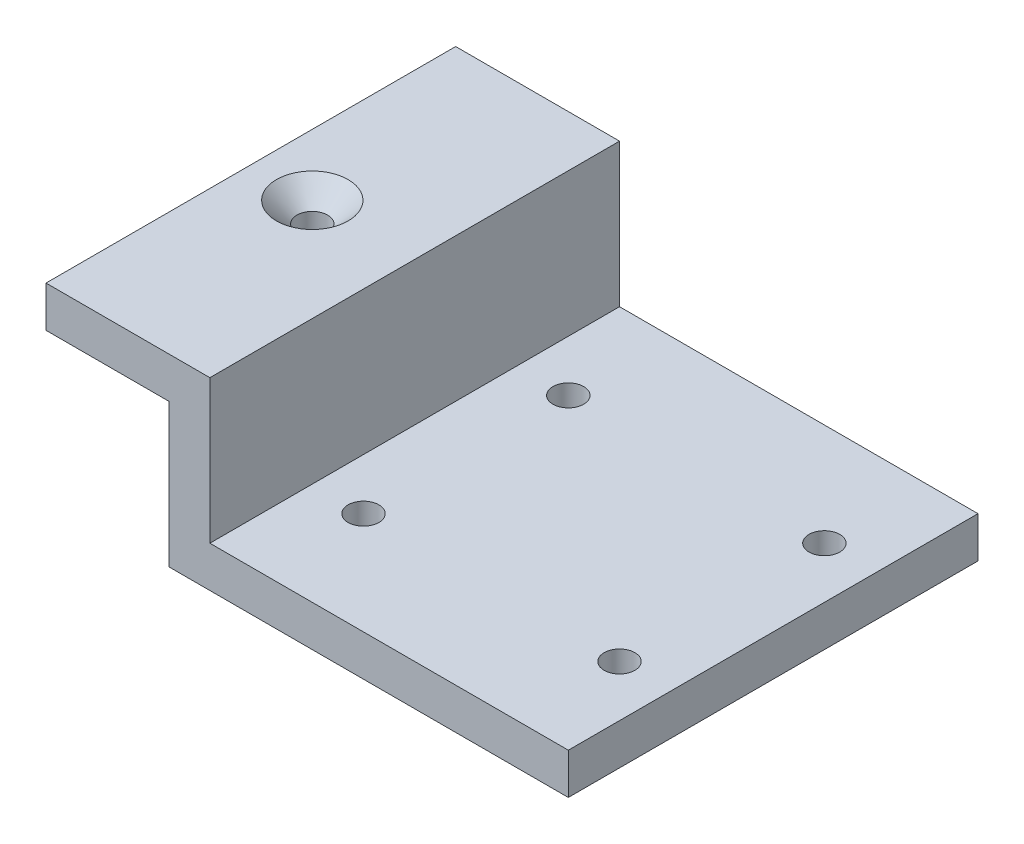
ISO-10303-21;
HEADER;
FILE_DESCRIPTION(('STEP AP214'),'2;1');
FILE_NAME('part.step','',(''),(''),'','','');
FILE_SCHEMA(('AUTOMOTIVE_DESIGN { 1 0 10303 214 1 1 1 1 }'));
ENDSEC;
DATA;
#1=APPLICATION_CONTEXT('core data for automotive mechanical design processes');
#2=APPLICATION_PROTOCOL_DEFINITION('international standard','automotive_design',2000,#1);
#3=PRODUCT_CONTEXT('',#1,'mechanical');
#4=PRODUCT('Part','Part','',(#3));
#5=PRODUCT_RELATED_PRODUCT_CATEGORY('part','',(#4));
#6=PRODUCT_DEFINITION_FORMATION('','',#4);
#7=PRODUCT_DEFINITION_CONTEXT('part definition',#1,'design');
#8=PRODUCT_DEFINITION('design','',#6,#7);
#9=PRODUCT_DEFINITION_SHAPE('','',#8);
#10=(LENGTH_UNIT() NAMED_UNIT(*) SI_UNIT(.MILLI.,.METRE.));
#11=(NAMED_UNIT(*) PLANE_ANGLE_UNIT() SI_UNIT($,.RADIAN.));
#12=(NAMED_UNIT(*) SI_UNIT($,.STERADIAN.) SOLID_ANGLE_UNIT());
#13=UNCERTAINTY_MEASURE_WITH_UNIT(LENGTH_MEASURE(1.E-05),#10,'distance_accuracy_value','');
#14=(GEOMETRIC_REPRESENTATION_CONTEXT(3) GLOBAL_UNCERTAINTY_ASSIGNED_CONTEXT((#13)) GLOBAL_UNIT_ASSIGNED_CONTEXT((#10,
#11,#12)) REPRESENTATION_CONTEXT('',''));
#15=CARTESIAN_POINT('',(0.,0.,0.));
#16=DIRECTION('',(0.,0.,1.));
#17=DIRECTION('',(1.,0.,0.));
#18=AXIS2_PLACEMENT_3D('',#15,#16,#17);
#19=CARTESIAN_POINT('',(-21.5,0.,0.));
#20=DIRECTION('',(1.,0.,0.));
#21=DIRECTION('',(0.,0.,-1.));
#22=AXIS2_PLACEMENT_3D('',#19,#20,#21);
#23=PLANE('',#22);
#24=DIRECTION('',(0.,0.,1.));
#25=VECTOR('',#24,1.);
#26=CARTESIAN_POINT('',(-21.5,14.,-20.));
#27=LINE('',#26,#25);
#28=CARTESIAN_POINT('',(-21.5,14.,-20.));
#29=VERTEX_POINT('',#28);
#30=CARTESIAN_POINT('',(-21.5,14.,20.));
#31=VERTEX_POINT('',#30);
#32=EDGE_CURVE('E53',#29,#31,#27,.T.);
#33=ORIENTED_EDGE('',*,*,#32,.F.);
#34=DIRECTION('',(0.,-1.,0.));
#35=VECTOR('',#34,1.);
#36=CARTESIAN_POINT('',(-21.5,0.,-20.));
#37=LINE('',#36,#35);
#38=CARTESIAN_POINT('',(-21.5,0.,-20.));
#39=VERTEX_POINT('',#38);
#40=EDGE_CURVE('E136',#29,#39,#37,.T.);
#41=ORIENTED_EDGE('',*,*,#40,.T.);
#42=DIRECTION('',(0.,0.,1.));
#43=VECTOR('',#42,1.);
#44=CARTESIAN_POINT('',(-21.5,0.,-20.));
#45=LINE('',#44,#43);
#46=CARTESIAN_POINT('',(-21.5,0.,20.));
#47=VERTEX_POINT('',#46);
#48=EDGE_CURVE('E145',#39,#47,#45,.T.);
#49=ORIENTED_EDGE('',*,*,#48,.T.);
#50=DIRECTION('',(0.,1.,0.));
#51=VECTOR('',#50,1.);
#52=CARTESIAN_POINT('',(-21.5,0.,20.));
#53=LINE('',#52,#51);
#54=EDGE_CURVE('E149',#47,#31,#53,.T.);
#55=ORIENTED_EDGE('',*,*,#54,.T.);
#56=EDGE_LOOP('',(#33,#41,#49,#55));
#57=FACE_BOUND('',#56,.T.);
#58=ADVANCED_FACE('F37',(#57),#23,.F.);
#59=CARTESIAN_POINT('',(0.,4.,0.));
#60=DIRECTION('',(0.,1.,0.));
#61=DIRECTION('',(0.,0.,1.));
#62=AXIS2_PLACEMENT_3D('',#59,#60,#61);
#63=PLANE('',#62);
#64=CARTESIAN_POINT('',(-12.5,4.,10.));
#65=DIRECTION('',(0.,1.,0.));
#66=DIRECTION('',(0.,0.,1.));
#67=AXIS2_PLACEMENT_3D('',#64,#65,#66);
#68=CIRCLE('',#67,1.5);
#69=CARTESIAN_POINT('',(-12.5,4.,11.5));
#70=VERTEX_POINT('',#69);
#71=EDGE_CURVE('E165',#70,#70,#68,.T.);
#72=ORIENTED_EDGE('',*,*,#71,.F.);
#73=EDGE_LOOP('',(#72));
#74=FACE_BOUND('',#73,.T.);
#75=CARTESIAN_POINT('',(12.5,4.,-10.));
#76=DIRECTION('',(0.,1.,0.));
#77=DIRECTION('',(0.,0.,1.));
#78=AXIS2_PLACEMENT_3D('',#75,#76,#77);
#79=CIRCLE('',#78,1.5);
#80=CARTESIAN_POINT('',(12.5,4.,-8.5));
#81=VERTEX_POINT('',#80);
#82=EDGE_CURVE('E177',#81,#81,#79,.T.);
#83=ORIENTED_EDGE('',*,*,#82,.F.);
#84=EDGE_LOOP('',(#83));
#85=FACE_BOUND('',#84,.T.);
#86=DIRECTION('',(0.,0.,1.));
#87=VECTOR('',#86,1.);
#88=CARTESIAN_POINT('',(-17.5,4.,-20.));
#89=LINE('',#88,#87);
#90=CARTESIAN_POINT('',(-17.5,4.,-20.));
#91=VERTEX_POINT('',#90);
#92=CARTESIAN_POINT('',(-17.5,4.,20.));
#93=VERTEX_POINT('',#92);
#94=EDGE_CURVE('E183',#91,#93,#89,.T.);
#95=ORIENTED_EDGE('',*,*,#94,.T.);
#96=DIRECTION('',(1.,0.,0.));
#97=VECTOR('',#96,1.);
#98=CARTESIAN_POINT('',(-17.5,4.,20.));
#99=LINE('',#98,#97);
#100=CARTESIAN_POINT('',(17.5,4.,20.));
#101=VERTEX_POINT('',#100);
#102=EDGE_CURVE('E186',#93,#101,#99,.T.);
#103=ORIENTED_EDGE('',*,*,#102,.T.);
#104=DIRECTION('',(0.,0.,-1.));
#105=VECTOR('',#104,1.);
#106=CARTESIAN_POINT('',(17.5,4.,-20.));
#107=LINE('',#106,#105);
#108=CARTESIAN_POINT('',(17.5,4.,-20.));
#109=VERTEX_POINT('',#108);
#110=EDGE_CURVE('E62',#101,#109,#107,.T.);
#111=ORIENTED_EDGE('',*,*,#110,.T.);
#112=DIRECTION('',(-1.,0.,0.));
#113=VECTOR('',#112,1.);
#114=CARTESIAN_POINT('',(-17.5,4.,-20.));
#115=LINE('',#114,#113);
#116=EDGE_CURVE('E190',#109,#91,#115,.T.);
#117=ORIENTED_EDGE('',*,*,#116,.T.);
#118=EDGE_LOOP('',(#95,#103,#111,#117));
#119=FACE_BOUND('',#118,.T.);
#120=CARTESIAN_POINT('',(-12.5,4.,-10.));
#121=DIRECTION('',(0.,1.,0.));
#122=DIRECTION('',(0.,0.,-1.));
#123=AXIS2_PLACEMENT_3D('',#120,#121,#122);
#124=CIRCLE('',#123,1.5);
#125=CARTESIAN_POINT('',(-12.5,4.,-11.5));
#126=VERTEX_POINT('',#125);
#127=EDGE_CURVE('E171',#126,#126,#124,.T.);
#128=ORIENTED_EDGE('',*,*,#127,.F.);
#129=EDGE_LOOP('',(#128));
#130=FACE_BOUND('',#129,.T.);
#131=CARTESIAN_POINT('',(12.5,4.,10.));
#132=DIRECTION('',(0.,1.,0.));
#133=DIRECTION('',(0.,0.,-1.));
#134=AXIS2_PLACEMENT_3D('',#131,#132,#133);
#135=CIRCLE('',#134,1.5);
#136=CARTESIAN_POINT('',(12.5,4.,8.5));
#137=VERTEX_POINT('',#136);
#138=EDGE_CURVE('E159',#137,#137,#135,.T.);
#139=ORIENTED_EDGE('',*,*,#138,.F.);
#140=EDGE_LOOP('',(#139));
#141=FACE_BOUND('',#140,.T.);
#142=ADVANCED_FACE('F212',(#74,#85,#119,#130,#141),#63,.T.);
#143=CARTESIAN_POINT('',(0.,0.,0.));
#144=DIRECTION('',(0.,1.,0.));
#145=DIRECTION('',(0.,0.,1.));
#146=AXIS2_PLACEMENT_3D('',#143,#144,#145);
#147=PLANE('',#146);
#148=DIRECTION('',(1.,0.,0.));
#149=VECTOR('',#148,1.);
#150=CARTESIAN_POINT('',(-17.5,0.,20.));
#151=LINE('',#150,#149);
#152=CARTESIAN_POINT('',(17.5,0.,20.));
#153=VERTEX_POINT('',#152);
#154=EDGE_CURVE('E180',#47,#153,#151,.T.);
#155=ORIENTED_EDGE('',*,*,#154,.F.);
#156=ORIENTED_EDGE('',*,*,#48,.F.);
#157=DIRECTION('',(-1.,0.,0.));
#158=VECTOR('',#157,1.);
#159=CARTESIAN_POINT('',(-17.5,0.,-20.));
#160=LINE('',#159,#158);
#161=CARTESIAN_POINT('',(17.5,0.,-20.));
#162=VERTEX_POINT('',#161);
#163=EDGE_CURVE('E187',#162,#39,#160,.T.);
#164=ORIENTED_EDGE('',*,*,#163,.F.);
#165=DIRECTION('',(0.,0.,-1.));
#166=VECTOR('',#165,1.);
#167=CARTESIAN_POINT('',(17.5,0.,-20.));
#168=LINE('',#167,#166);
#169=EDGE_CURVE('E76',#153,#162,#168,.T.);
#170=ORIENTED_EDGE('',*,*,#169,.F.);
#171=EDGE_LOOP('',(#155,#156,#164,#170));
#172=FACE_BOUND('',#171,.T.);
#173=CARTESIAN_POINT('',(12.5,0.,-10.));
#174=DIRECTION('',(0.,1.,0.));
#175=DIRECTION('',(0.,0.,1.));
#176=AXIS2_PLACEMENT_3D('',#173,#174,#175);
#177=CIRCLE('',#176,1.5);
#178=CARTESIAN_POINT('',(12.5,0.,-8.5));
#179=VERTEX_POINT('',#178);
#180=EDGE_CURVE('E174',#179,#179,#177,.T.);
#181=ORIENTED_EDGE('',*,*,#180,.T.);
#182=EDGE_LOOP('',(#181));
#183=FACE_BOUND('',#182,.T.);
#184=CARTESIAN_POINT('',(-12.5,0.,-10.));
#185=DIRECTION('',(0.,1.,0.));
#186=DIRECTION('',(0.,0.,-1.));
#187=AXIS2_PLACEMENT_3D('',#184,#185,#186);
#188=CIRCLE('',#187,1.5);
#189=CARTESIAN_POINT('',(-12.5,0.,-11.5));
#190=VERTEX_POINT('',#189);
#191=EDGE_CURVE('E168',#190,#190,#188,.T.);
#192=ORIENTED_EDGE('',*,*,#191,.T.);
#193=EDGE_LOOP('',(#192));
#194=FACE_BOUND('',#193,.T.);
#195=CARTESIAN_POINT('',(-12.5,0.,10.));
#196=DIRECTION('',(0.,1.,0.));
#197=DIRECTION('',(0.,0.,1.));
#198=AXIS2_PLACEMENT_3D('',#195,#196,#197);
#199=CIRCLE('',#198,1.5);
#200=CARTESIAN_POINT('',(-12.5,0.,11.5));
#201=VERTEX_POINT('',#200);
#202=EDGE_CURVE('E162',#201,#201,#199,.T.);
#203=ORIENTED_EDGE('',*,*,#202,.T.);
#204=EDGE_LOOP('',(#203));
#205=FACE_BOUND('',#204,.T.);
#206=CARTESIAN_POINT('',(12.5,0.,10.));
#207=DIRECTION('',(0.,1.,0.));
#208=DIRECTION('',(0.,0.,-1.));
#209=AXIS2_PLACEMENT_3D('',#206,#207,#208);
#210=CIRCLE('',#209,1.5);
#211=CARTESIAN_POINT('',(12.5,0.,8.5));
#212=VERTEX_POINT('',#211);
#213=EDGE_CURVE('E158',#212,#212,#210,.T.);
#214=ORIENTED_EDGE('',*,*,#213,.T.);
#215=EDGE_LOOP('',(#214));
#216=FACE_BOUND('',#215,.T.);
#217=ADVANCED_FACE('F217',(#172,#183,#194,#205,#216),#147,.F.);
#218=CARTESIAN_POINT('',(-17.5,4.,20.));
#219=DIRECTION('',(0.,0.,-1.));
#220=DIRECTION('',(-1.,0.,0.));
#221=AXIS2_PLACEMENT_3D('',#218,#219,#220);
#222=PLANE('',#221);
#223=ORIENTED_EDGE('',*,*,#154,.T.);
#224=DIRECTION('',(0.,-1.,0.));
#225=VECTOR('',#224,1.);
#226=CARTESIAN_POINT('',(17.5,4.,20.));
#227=LINE('',#226,#225);
#228=EDGE_CURVE('E197',#101,#153,#227,.T.);
#229=ORIENTED_EDGE('',*,*,#228,.F.);
#230=ORIENTED_EDGE('',*,*,#102,.F.);
#231=DIRECTION('',(0.,1.,0.));
#232=VECTOR('',#231,1.);
#233=CARTESIAN_POINT('',(-17.5,0.,20.));
#234=LINE('',#233,#232);
#235=CARTESIAN_POINT('',(-17.5,18.,20.));
#236=VERTEX_POINT('',#235);
#237=EDGE_CURVE('E83',#93,#236,#234,.T.);
#238=ORIENTED_EDGE('',*,*,#237,.T.);
#239=DIRECTION('',(1.,0.,0.));
#240=VECTOR('',#239,1.);
#241=CARTESIAN_POINT('',(-21.5,18.,20.));
#242=LINE('',#241,#240);
#243=CARTESIAN_POINT('',(-33.5,18.,20.));
#244=VERTEX_POINT('',#243);
#245=EDGE_CURVE('E155',#244,#236,#242,.T.);
#246=ORIENTED_EDGE('',*,*,#245,.F.);
#247=DIRECTION('',(0.,1.,0.));
#248=VECTOR('',#247,1.);
#249=CARTESIAN_POINT('',(-33.5,18.,20.));
#250=LINE('',#249,#248);
#251=CARTESIAN_POINT('',(-33.5,14.,20.));
#252=VERTEX_POINT('',#251);
#253=EDGE_CURVE('E123',#252,#244,#250,.T.);
#254=ORIENTED_EDGE('',*,*,#253,.F.);
#255=DIRECTION('',(1.,0.,0.));
#256=VECTOR('',#255,1.);
#257=CARTESIAN_POINT('',(-33.5,14.,20.));
#258=LINE('',#257,#256);
#259=EDGE_CURVE('E119',#252,#31,#258,.T.);
#260=ORIENTED_EDGE('',*,*,#259,.T.);
#261=ORIENTED_EDGE('',*,*,#54,.F.);
#262=EDGE_LOOP('',(#223,#229,#230,#238,#246,#254,#260,#261));
#263=FACE_BOUND('',#262,.T.);
#264=ADVANCED_FACE('F248',(#263),#222,.F.);
#265=CARTESIAN_POINT('',(17.5,4.,-20.));
#266=DIRECTION('',(-1.,0.,0.));
#267=DIRECTION('',(0.,0.,1.));
#268=AXIS2_PLACEMENT_3D('',#265,#266,#267);
#269=PLANE('',#268);
#270=ORIENTED_EDGE('',*,*,#169,.T.);
#271=DIRECTION('',(0.,-1.,0.));
#272=VECTOR('',#271,1.);
#273=CARTESIAN_POINT('',(17.5,4.,-20.));
#274=LINE('',#273,#272);
#275=EDGE_CURVE('E192',#109,#162,#274,.T.);
#276=ORIENTED_EDGE('',*,*,#275,.F.);
#277=ORIENTED_EDGE('',*,*,#110,.F.);
#278=ORIENTED_EDGE('',*,*,#228,.T.);
#279=EDGE_LOOP('',(#270,#276,#277,#278));
#280=FACE_BOUND('',#279,.T.);
#281=ADVANCED_FACE('F252',(#280),#269,.F.);
#282=CARTESIAN_POINT('',(-17.5,4.,-20.));
#283=DIRECTION('',(0.,0.,1.));
#284=DIRECTION('',(1.,0.,0.));
#285=AXIS2_PLACEMENT_3D('',#282,#283,#284);
#286=PLANE('',#285);
#287=ORIENTED_EDGE('',*,*,#163,.T.);
#288=ORIENTED_EDGE('',*,*,#40,.F.);
#289=DIRECTION('',(1.,0.,0.));
#290=VECTOR('',#289,1.);
#291=CARTESIAN_POINT('',(-33.5,14.,-20.));
#292=LINE('',#291,#290);
#293=CARTESIAN_POINT('',(-33.5,14.,-20.));
#294=VERTEX_POINT('',#293);
#295=EDGE_CURVE('E117',#294,#29,#292,.T.);
#296=ORIENTED_EDGE('',*,*,#295,.F.);
#297=DIRECTION('',(0.,-1.,0.));
#298=VECTOR('',#297,1.);
#299=CARTESIAN_POINT('',(-33.5,18.,-20.));
#300=LINE('',#299,#298);
#301=CARTESIAN_POINT('',(-33.5,18.,-20.));
#302=VERTEX_POINT('',#301);
#303=EDGE_CURVE('E124',#302,#294,#300,.T.);
#304=ORIENTED_EDGE('',*,*,#303,.F.);
#305=DIRECTION('',(1.,0.,0.));
#306=VECTOR('',#305,1.);
#307=CARTESIAN_POINT('',(-21.5,18.,-20.));
#308=LINE('',#307,#306);
#309=CARTESIAN_POINT('',(-17.5,18.,-20.));
#310=VERTEX_POINT('',#309);
#311=EDGE_CURVE('E150',#302,#310,#308,.T.);
#312=ORIENTED_EDGE('',*,*,#311,.T.);
#313=DIRECTION('',(0.,-1.,0.));
#314=VECTOR('',#313,1.);
#315=CARTESIAN_POINT('',(-17.5,0.,-20.));
#316=LINE('',#315,#314);
#317=EDGE_CURVE('E137',#310,#91,#316,.T.);
#318=ORIENTED_EDGE('',*,*,#317,.T.);
#319=ORIENTED_EDGE('',*,*,#116,.F.);
#320=ORIENTED_EDGE('',*,*,#275,.T.);
#321=EDGE_LOOP('',(#287,#288,#296,#304,#312,#318,#319,#320));
#322=FACE_BOUND('',#321,.T.);
#323=ADVANCED_FACE('F135',(#322),#286,.F.);
#324=CARTESIAN_POINT('',(12.5,4.,-10.));
#325=DIRECTION('',(0.,-1.,0.));
#326=DIRECTION('',(0.,0.,-1.));
#327=AXIS2_PLACEMENT_3D('',#324,#325,#326);
#328=CYLINDRICAL_SURFACE('',#327,1.5);
#329=ORIENTED_EDGE('',*,*,#82,.T.);
#330=EDGE_LOOP('',(#329));
#331=FACE_BOUND('',#330,.T.);
#332=ORIENTED_EDGE('',*,*,#180,.F.);
#333=EDGE_LOOP('',(#332));
#334=FACE_BOUND('',#333,.T.);
#335=ADVANCED_FACE('F241',(#331,#334),#328,.F.);
#336=CARTESIAN_POINT('',(-12.5,4.,-10.));
#337=DIRECTION('',(0.,-1.,0.));
#338=DIRECTION('',(0.,0.,-1.));
#339=AXIS2_PLACEMENT_3D('',#336,#337,#338);
#340=CYLINDRICAL_SURFACE('',#339,1.5);
#341=ORIENTED_EDGE('',*,*,#127,.T.);
#342=EDGE_LOOP('',(#341));
#343=FACE_BOUND('',#342,.T.);
#344=ORIENTED_EDGE('',*,*,#191,.F.);
#345=EDGE_LOOP('',(#344));
#346=FACE_BOUND('',#345,.T.);
#347=ADVANCED_FACE('F237',(#343,#346),#340,.F.);
#348=CARTESIAN_POINT('',(-12.5,4.,10.));
#349=DIRECTION('',(0.,-1.,0.));
#350=DIRECTION('',(0.,0.,-1.));
#351=AXIS2_PLACEMENT_3D('',#348,#349,#350);
#352=CYLINDRICAL_SURFACE('',#351,1.5);
#353=ORIENTED_EDGE('',*,*,#71,.T.);
#354=EDGE_LOOP('',(#353));
#355=FACE_BOUND('',#354,.T.);
#356=ORIENTED_EDGE('',*,*,#202,.F.);
#357=EDGE_LOOP('',(#356));
#358=FACE_BOUND('',#357,.T.);
#359=ADVANCED_FACE('F233',(#355,#358),#352,.F.);
#360=CARTESIAN_POINT('',(12.5,4.,10.));
#361=DIRECTION('',(0.,-1.,0.));
#362=DIRECTION('',(0.,0.,-1.));
#363=AXIS2_PLACEMENT_3D('',#360,#361,#362);
#364=CYLINDRICAL_SURFACE('',#363,1.5);
#365=ORIENTED_EDGE('',*,*,#138,.T.);
#366=EDGE_LOOP('',(#365));
#367=FACE_BOUND('',#366,.T.);
#368=ORIENTED_EDGE('',*,*,#213,.F.);
#369=EDGE_LOOP('',(#368));
#370=FACE_BOUND('',#369,.T.);
#371=ADVANCED_FACE('F227',(#367,#370),#364,.F.);
#372=CARTESIAN_POINT('',(-17.5,0.,0.));
#373=DIRECTION('',(1.,0.,0.));
#374=DIRECTION('',(0.,0.,-1.));
#375=AXIS2_PLACEMENT_3D('',#372,#373,#374);
#376=PLANE('',#375);
#377=ORIENTED_EDGE('',*,*,#94,.F.);
#378=ORIENTED_EDGE('',*,*,#317,.F.);
#379=DIRECTION('',(0.,0.,-1.));
#380=VECTOR('',#379,1.);
#381=CARTESIAN_POINT('',(-17.5,18.,-20.));
#382=LINE('',#381,#380);
#383=EDGE_CURVE('E146',#236,#310,#382,.T.);
#384=ORIENTED_EDGE('',*,*,#383,.F.);
#385=ORIENTED_EDGE('',*,*,#237,.F.);
#386=EDGE_LOOP('',(#377,#378,#384,#385));
#387=FACE_BOUND('',#386,.T.);
#388=ADVANCED_FACE('F223',(#387),#376,.T.);
#389=CARTESIAN_POINT('',(-21.5,18.,-20.));
#390=DIRECTION('',(0.,-1.,0.));
#391=DIRECTION('',(0.,0.,-1.));
#392=AXIS2_PLACEMENT_3D('',#389,#390,#391);
#393=PLANE('',#392);
#394=CARTESIAN_POINT('',(-27.5,18.,0.));
#395=DIRECTION('',(0.,-1.,0.));
#396=DIRECTION('',(0.,0.,-1.));
#397=AXIS2_PLACEMENT_3D('',#394,#395,#396);
#398=CIRCLE('',#397,3.50000000000002);
#399=CARTESIAN_POINT('',(-27.5,18.,-3.50000000000002));
#400=VERTEX_POINT('',#399);
#401=EDGE_CURVE('E11',#400,#400,#398,.T.);
#402=ORIENTED_EDGE('',*,*,#401,.T.);
#403=EDGE_LOOP('',(#402));
#404=FACE_BOUND('',#403,.T.);
#405=ORIENTED_EDGE('',*,*,#383,.T.);
#406=ORIENTED_EDGE('',*,*,#311,.F.);
#407=DIRECTION('',(0.,0.,-1.));
#408=VECTOR('',#407,1.);
#409=CARTESIAN_POINT('',(-33.5,18.,-20.));
#410=LINE('',#409,#408);
#411=EDGE_CURVE('E130',#244,#302,#410,.T.);
#412=ORIENTED_EDGE('',*,*,#411,.F.);
#413=ORIENTED_EDGE('',*,*,#245,.T.);
#414=EDGE_LOOP('',(#405,#406,#412,#413));
#415=FACE_BOUND('',#414,.T.);
#416=ADVANCED_FACE('F226',(#404,#415),#393,.F.);
#417=CARTESIAN_POINT('',(-33.5,14.,-20.));
#418=DIRECTION('',(0.,1.,0.));
#419=DIRECTION('',(0.,0.,1.));
#420=AXIS2_PLACEMENT_3D('',#417,#418,#419);
#421=PLANE('',#420);
#422=CARTESIAN_POINT('',(-27.5,14.,0.));
#423=DIRECTION('',(0.,1.,0.));
#424=DIRECTION('',(0.,0.,1.));
#425=AXIS2_PLACEMENT_3D('',#422,#423,#424);
#426=CIRCLE('',#425,1.5);
#427=CARTESIAN_POINT('',(-27.5,14.,1.5));
#428=VERTEX_POINT('',#427);
#429=EDGE_CURVE('E269',#428,#428,#426,.F.);
#430=ORIENTED_EDGE('',*,*,#429,.F.);
#431=EDGE_LOOP('',(#430));
#432=FACE_BOUND('',#431,.T.);
#433=ORIENTED_EDGE('',*,*,#32,.T.);
#434=ORIENTED_EDGE('',*,*,#259,.F.);
#435=DIRECTION('',(0.,0.,1.));
#436=VECTOR('',#435,1.);
#437=CARTESIAN_POINT('',(-33.5,14.,-20.));
#438=LINE('',#437,#436);
#439=EDGE_CURVE('E113',#294,#252,#438,.T.);
#440=ORIENTED_EDGE('',*,*,#439,.F.);
#441=ORIENTED_EDGE('',*,*,#295,.T.);
#442=EDGE_LOOP('',(#433,#434,#440,#441));
#443=FACE_BOUND('',#442,.T.);
#444=ADVANCED_FACE('F115',(#432,#443),#421,.F.);
#445=CARTESIAN_POINT('',(-33.5,0.,0.));
#446=DIRECTION('',(-1.,0.,0.));
#447=DIRECTION('',(0.,0.,1.));
#448=AXIS2_PLACEMENT_3D('',#445,#446,#447);
#449=PLANE('',#448);
#450=ORIENTED_EDGE('',*,*,#303,.T.);
#451=ORIENTED_EDGE('',*,*,#439,.T.);
#452=ORIENTED_EDGE('',*,*,#253,.T.);
#453=ORIENTED_EDGE('',*,*,#411,.T.);
#454=EDGE_LOOP('',(#450,#451,#452,#453));
#455=FACE_BOUND('',#454,.T.);
#456=ADVANCED_FACE('F128',(#455),#449,.T.);
#457=CARTESIAN_POINT('',(-27.5,-0.001000000000001,0.));
#458=DIRECTION('',(0.,1.,0.));
#459=DIRECTION('',(0.,0.,1.));
#460=AXIS2_PLACEMENT_3D('',#457,#458,#459);
#461=CYLINDRICAL_SURFACE('',#460,1.5);
#462=CARTESIAN_POINT('',(-27.5,16.,0.));
#463=DIRECTION('',(0.,-1.,0.));
#464=DIRECTION('',(0.,0.,-1.));
#465=AXIS2_PLACEMENT_3D('',#462,#463,#464);
#466=CIRCLE('',#465,1.5);
#467=CARTESIAN_POINT('',(-27.5,16.,-1.5));
#468=VERTEX_POINT('',#467);
#469=EDGE_CURVE('E46',#468,#468,#466,.F.);
#470=ORIENTED_EDGE('',*,*,#469,.T.);
#471=EDGE_LOOP('',(#470));
#472=FACE_BOUND('',#471,.T.);
#473=ORIENTED_EDGE('',*,*,#429,.T.);
#474=EDGE_LOOP('',(#473));
#475=FACE_BOUND('',#474,.T.);
#476=ADVANCED_FACE('F201',(#472,#475),#461,.F.);
#477=CARTESIAN_POINT('',(-27.5,16.,0.));
#478=DIRECTION('',(0.,1.,0.));
#479=DIRECTION('',(0.,0.,1.));
#480=AXIS2_PLACEMENT_3D('',#477,#478,#479);
#481=CONICAL_SURFACE('',#480,1.5,0.785398163397449);
#482=ORIENTED_EDGE('',*,*,#401,.F.);
#483=EDGE_LOOP('',(#482));
#484=FACE_BOUND('',#483,.T.);
#485=ORIENTED_EDGE('',*,*,#469,.F.);
#486=EDGE_LOOP('',(#485));
#487=FACE_BOUND('',#486,.T.);
#488=ADVANCED_FACE('F40',(#484,#487),#481,.F.);
#489=CLOSED_SHELL('',(#58,#142,#217,#264,#281,#323,#335,#347,#359,#371,#388,#416,#444,#456,#476,#488));
#490=MANIFOLD_SOLID_BREP('B2',#489);
#491=ADVANCED_BREP_SHAPE_REPRESENTATION('',(#18,#490),#14);
#492=SHAPE_DEFINITION_REPRESENTATION(#9,#491);
ENDSEC;
END-ISO-10303-21;
